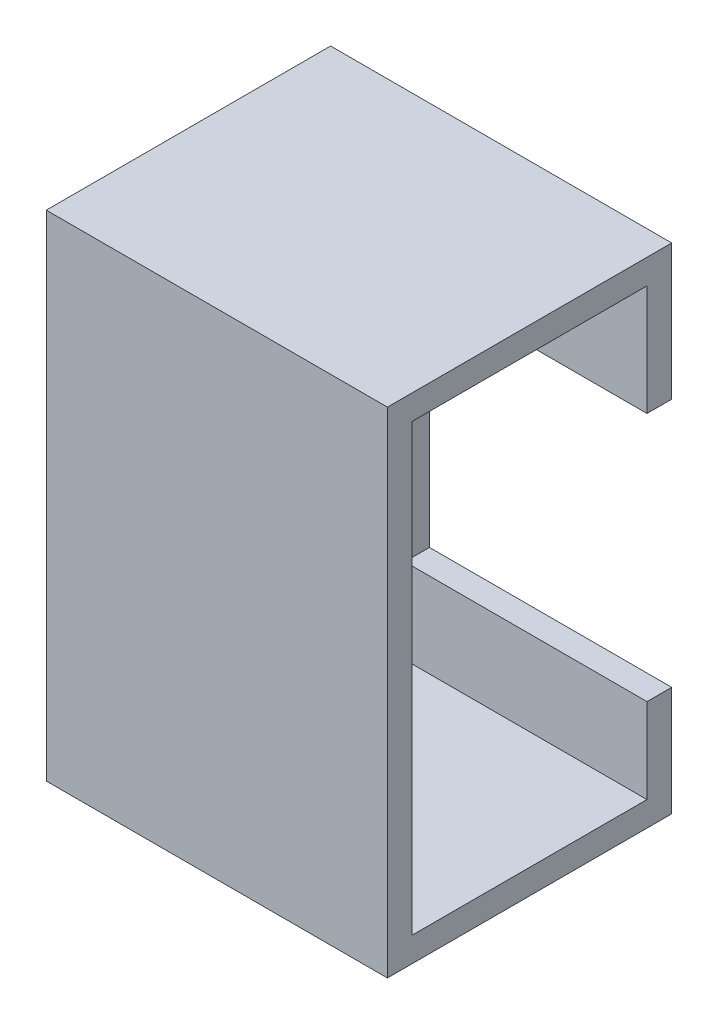
ISO-10303-21;
HEADER;
FILE_DESCRIPTION(('STEP AP214'),'2;1');
FILE_NAME('part.step','',(''),(''),'','','');
FILE_SCHEMA(('AUTOMOTIVE_DESIGN { 1 0 10303 214 1 1 1 1 }'));
ENDSEC;
DATA;
#1=APPLICATION_CONTEXT('core data for automotive mechanical design processes');
#2=APPLICATION_PROTOCOL_DEFINITION('international standard','automotive_design',2000,#1);
#3=PRODUCT_CONTEXT('',#1,'mechanical');
#4=PRODUCT('Part','Part','',(#3));
#5=PRODUCT_RELATED_PRODUCT_CATEGORY('part','',(#4));
#6=PRODUCT_DEFINITION_FORMATION('','',#4);
#7=PRODUCT_DEFINITION_CONTEXT('part definition',#1,'design');
#8=PRODUCT_DEFINITION('design','',#6,#7);
#9=PRODUCT_DEFINITION_SHAPE('','',#8);
#10=(LENGTH_UNIT() NAMED_UNIT(*) SI_UNIT(.MILLI.,.METRE.));
#11=(NAMED_UNIT(*) PLANE_ANGLE_UNIT() SI_UNIT($,.RADIAN.));
#12=(NAMED_UNIT(*) SI_UNIT($,.STERADIAN.) SOLID_ANGLE_UNIT());
#13=UNCERTAINTY_MEASURE_WITH_UNIT(LENGTH_MEASURE(1.E-05),#10,'distance_accuracy_value','');
#14=(GEOMETRIC_REPRESENTATION_CONTEXT(3) GLOBAL_UNCERTAINTY_ASSIGNED_CONTEXT((#13)) GLOBAL_UNIT_ASSIGNED_CONTEXT((#10,
#11,#12)) REPRESENTATION_CONTEXT('',''));
#15=CARTESIAN_POINT('',(0.,0.,0.));
#16=DIRECTION('',(0.,0.,1.));
#17=DIRECTION('',(1.,0.,0.));
#18=AXIS2_PLACEMENT_3D('',#15,#16,#17);
#19=CARTESIAN_POINT('',(-0.0250452000000723,82.477794755773,65.871101315515));
#20=DIRECTION('',(1.,0.,0.));
#21=DIRECTION('',(0.,0.,-1.));
#22=AXIS2_PLACEMENT_3D('',#19,#20,#21);
#23=PLANE('',#22);
#24=DIRECTION('',(0.,0.,1.));
#25=VECTOR('',#24,1.);
#26=CARTESIAN_POINT('',(-0.0250452000000723,87.4777847557731,63.996962315515));
#27=LINE('',#26,#25);
#28=CARTESIAN_POINT('',(-0.0250452000000723,87.4777847557731,62.9958213155149));
#29=VERTEX_POINT('',#28);
#30=CARTESIAN_POINT('',(-0.0250452000000723,87.4777847557731,68.746381315515));
#31=VERTEX_POINT('',#30);
#32=EDGE_CURVE('E11',#29,#31,#27,.T.);
#33=ORIENTED_EDGE('',*,*,#32,.F.);
#34=DIRECTION('',(0.,-1.,0.));
#35=VECTOR('',#34,1.);
#36=CARTESIAN_POINT('',(-0.0250452000000723,87.4777847557731,62.9958213155149));
#37=LINE('',#36,#35);
#38=CARTESIAN_POINT('',(-0.0250452000000745,77.4778047557729,62.9958213155149));
#39=VERTEX_POINT('',#38);
#40=EDGE_CURVE('E192',#29,#39,#37,.T.);
#41=ORIENTED_EDGE('',*,*,#40,.T.);
#42=DIRECTION('',(0.,0.,1.));
#43=VECTOR('',#42,1.);
#44=CARTESIAN_POINT('',(-0.0250452000000745,77.4778047557729,62.9958213155149));
#45=LINE('',#44,#43);
#46=CARTESIAN_POINT('',(-0.0250452000000723,77.4778047557729,68.746381315515));
#47=VERTEX_POINT('',#46);
#48=EDGE_CURVE('E185',#39,#47,#45,.T.);
#49=ORIENTED_EDGE('',*,*,#48,.T.);
#50=DIRECTION('',(0.,1.,0.));
#51=VECTOR('',#50,1.);
#52=CARTESIAN_POINT('',(-0.0250452000000723,77.4778047557729,68.746381315515));
#53=LINE('',#52,#51);
#54=EDGE_CURVE('E215',#47,#31,#53,.T.);
#55=ORIENTED_EDGE('',*,*,#54,.T.);
#56=EDGE_LOOP('',(#33,#41,#49,#55));
#57=FACE_BOUND('',#56,.T.);
#58=ADVANCED_FACE('F16',(#57),#23,.F.);
#59=CARTESIAN_POINT('',(0.874954799999929,82.477794755773,65.871101315515));
#60=DIRECTION('',(1.,0.,0.));
#61=DIRECTION('',(0.,0.,-1.));
#62=AXIS2_PLACEMENT_3D('',#59,#60,#61);
#63=PLANE('',#62);
#64=DIRECTION('',(0.,0.,1.));
#65=VECTOR('',#64,1.);
#66=CARTESIAN_POINT('',(0.874954799999929,86.977404755773,63.4962013155149));
#67=LINE('',#66,#65);
#68=CARTESIAN_POINT('',(0.874954799999929,86.977404755773,63.4962013155149));
#69=VERTEX_POINT('',#68);
#70=CARTESIAN_POINT('',(0.874954799999929,86.977404755773,68.246001315515));
#71=VERTEX_POINT('',#70);
#72=EDGE_CURVE('E163',#69,#71,#67,.T.);
#73=ORIENTED_EDGE('',*,*,#72,.T.);
#74=DIRECTION('',(0.,-1.,0.));
#75=VECTOR('',#74,1.);
#76=CARTESIAN_POINT('',(0.874954799999929,86.977404755773,68.246001315515));
#77=LINE('',#76,#75);
#78=CARTESIAN_POINT('',(0.874954799999929,77.978184755773,68.246001315515));
#79=VERTEX_POINT('',#78);
#80=EDGE_CURVE('E174',#71,#79,#77,.T.);
#81=ORIENTED_EDGE('',*,*,#80,.T.);
#82=DIRECTION('',(0.,0.,-1.));
#83=VECTOR('',#82,1.);
#84=CARTESIAN_POINT('',(0.874954799999929,77.978184755773,68.246001315515));
#85=LINE('',#84,#83);
#86=CARTESIAN_POINT('',(0.874954799999926,77.978184755773,63.4962013155149));
#87=VERTEX_POINT('',#86);
#88=EDGE_CURVE('E158',#79,#87,#85,.T.);
#89=ORIENTED_EDGE('',*,*,#88,.T.);
#90=DIRECTION('',(0.,1.,0.));
#91=VECTOR('',#90,1.);
#92=CARTESIAN_POINT('',(0.874954799999926,77.978184755773,63.4962013155149));
#93=LINE('',#92,#91);
#94=EDGE_CURVE('E189',#87,#69,#93,.T.);
#95=ORIENTED_EDGE('',*,*,#94,.T.);
#96=EDGE_LOOP('',(#73,#81,#89,#95));
#97=FACE_BOUND('',#96,.T.);
#98=ADVANCED_FACE('F305',(#97),#63,.T.);
#99=CARTESIAN_POINT('',(-0.0250452000000723,87.4777847557731,62.9958213155149));
#100=DIRECTION('',(0.,1.,0.));
#101=DIRECTION('',(1.,0.,0.));
#102=AXIS2_PLACEMENT_3D('',#99,#100,#101);
#103=PLANE('',#102);
#104=ORIENTED_EDGE('',*,*,#32,.T.);
#105=DIRECTION('',(1.,0.,0.));
#106=VECTOR('',#105,1.);
#107=CARTESIAN_POINT('',(-0.0250452000000723,87.4777847557731,68.746381315515));
#108=LINE('',#107,#106);
#109=CARTESIAN_POINT('',(6.87495479999993,87.4777847557731,68.746381315515));
#110=VERTEX_POINT('',#109);
#111=EDGE_CURVE('E27',#31,#110,#108,.T.);
#112=ORIENTED_EDGE('',*,*,#111,.T.);
#113=DIRECTION('',(0.,0.,1.));
#114=VECTOR('',#113,1.);
#115=CARTESIAN_POINT('',(6.87495479999993,87.4777847557731,63.996962315515));
#116=LINE('',#115,#114);
#117=CARTESIAN_POINT('',(6.87495479999993,87.4777847557731,62.9958213155149));
#118=VERTEX_POINT('',#117);
#119=EDGE_CURVE('E208',#118,#110,#116,.T.);
#120=ORIENTED_EDGE('',*,*,#119,.F.);
#121=DIRECTION('',(1.,0.,0.));
#122=VECTOR('',#121,1.);
#123=CARTESIAN_POINT('',(-0.0250452000000723,87.4777847557731,62.9958213155149));
#124=LINE('',#123,#122);
#125=EDGE_CURVE('E190',#29,#118,#124,.T.);
#126=ORIENTED_EDGE('',*,*,#125,.F.);
#127=EDGE_LOOP('',(#104,#112,#120,#126));
#128=FACE_BOUND('',#127,.T.);
#129=ADVANCED_FACE('F18',(#128),#103,.T.);
#130=CARTESIAN_POINT('',(-0.0250452000000723,87.4777847557731,68.746381315515));
#131=DIRECTION('',(0.,0.,1.));
#132=DIRECTION('',(1.,0.,0.));
#133=AXIS2_PLACEMENT_3D('',#130,#131,#132);
#134=PLANE('',#133);
#135=ORIENTED_EDGE('',*,*,#54,.F.);
#136=DIRECTION('',(1.,0.,0.));
#137=VECTOR('',#136,1.);
#138=CARTESIAN_POINT('',(-0.0250452000000723,77.4778047557729,68.746381315515));
#139=LINE('',#138,#137);
#140=CARTESIAN_POINT('',(6.87495479999993,77.4778047557729,68.746381315515));
#141=VERTEX_POINT('',#140);
#142=EDGE_CURVE('E109',#47,#141,#139,.T.);
#143=ORIENTED_EDGE('',*,*,#142,.T.);
#144=DIRECTION('',(0.,-1.,0.));
#145=VECTOR('',#144,1.);
#146=CARTESIAN_POINT('',(6.87495479999993,77.4778047557729,68.746381315515));
#147=LINE('',#146,#145);
#148=EDGE_CURVE('E211',#110,#141,#147,.T.);
#149=ORIENTED_EDGE('',*,*,#148,.F.);
#150=ORIENTED_EDGE('',*,*,#111,.F.);
#151=EDGE_LOOP('',(#135,#143,#149,#150));
#152=FACE_BOUND('',#151,.T.);
#153=ADVANCED_FACE('F295',(#152),#134,.T.);
#154=CARTESIAN_POINT('',(-0.02504520000007,77.4778047557729,68.746381315515));
#155=DIRECTION('',(0.,-1.,0.));
#156=DIRECTION('',(-1.,0.,0.));
#157=AXIS2_PLACEMENT_3D('',#154,#155,#156);
#158=PLANE('',#157);
#159=ORIENTED_EDGE('',*,*,#48,.F.);
#160=DIRECTION('',(1.,0.,0.));
#161=VECTOR('',#160,1.);
#162=CARTESIAN_POINT('',(-0.0250452000000745,77.4778047557729,62.9958213155149));
#163=LINE('',#162,#161);
#164=CARTESIAN_POINT('',(6.87495479999993,77.4778047557729,62.9958213155149));
#165=VERTEX_POINT('',#164);
#166=EDGE_CURVE('E94',#39,#165,#163,.T.);
#167=ORIENTED_EDGE('',*,*,#166,.T.);
#168=DIRECTION('',(0.,0.,-1.));
#169=VECTOR('',#168,1.);
#170=CARTESIAN_POINT('',(6.87495479999993,77.4778047557729,62.9958213155149));
#171=LINE('',#170,#169);
#172=EDGE_CURVE('E232',#141,#165,#171,.T.);
#173=ORIENTED_EDGE('',*,*,#172,.F.);
#174=ORIENTED_EDGE('',*,*,#142,.F.);
#175=EDGE_LOOP('',(#159,#167,#173,#174));
#176=FACE_BOUND('',#175,.T.);
#177=ADVANCED_FACE('F297',(#176),#158,.T.);
#178=CARTESIAN_POINT('',(-0.0250452000000723,86.977404755773,63.4962013155149));
#179=DIRECTION('',(0.,0.,1.));
#180=DIRECTION('',(1.,0.,0.));
#181=AXIS2_PLACEMENT_3D('',#178,#179,#180);
#182=PLANE('',#181);
#183=ORIENTED_EDGE('',*,*,#94,.F.);
#184=DIRECTION('',(1.,0.,0.));
#185=VECTOR('',#184,1.);
#186=CARTESIAN_POINT('',(-0.0250452000000745,77.978184755773,63.4962013155149));
#187=LINE('',#186,#185);
#188=CARTESIAN_POINT('',(6.87495479999993,77.978184755773,63.4962013155149));
#189=VERTEX_POINT('',#188);
#190=EDGE_CURVE('E194',#87,#189,#187,.T.);
#191=ORIENTED_EDGE('',*,*,#190,.T.);
#192=DIRECTION('',(0.,-1.,0.));
#193=VECTOR('',#192,1.);
#194=CARTESIAN_POINT('',(6.87495479999993,77.978184755773,63.4962013155149));
#195=LINE('',#194,#193);
#196=CARTESIAN_POINT('',(6.87495479999993,79.6940253678448,63.4962013155149));
#197=VERTEX_POINT('',#196);
#198=EDGE_CURVE('E148',#197,#189,#195,.T.);
#199=ORIENTED_EDGE('',*,*,#198,.F.);
#200=DIRECTION('',(-1.,0.,0.));
#201=VECTOR('',#200,1.);
#202=CARTESIAN_POINT('',(3.42495479999993,79.6940253678448,63.4962013155149));
#203=LINE('',#202,#201);
#204=CARTESIAN_POINT('',(1.97495479999993,79.6940253678448,63.4962013155149));
#205=VERTEX_POINT('',#204);
#206=EDGE_CURVE('E200',#197,#205,#203,.T.);
#207=ORIENTED_EDGE('',*,*,#206,.T.);
#208=DIRECTION('',(0.,1.,0.));
#209=VECTOR('',#208,1.);
#210=CARTESIAN_POINT('',(1.97495479999993,84.5974293725334,63.4962013155149));
#211=LINE('',#210,#209);
#212=CARTESIAN_POINT('',(1.97495479999993,84.7408826107429,63.4962013155149));
#213=VERTEX_POINT('',#212);
#214=EDGE_CURVE('E245',#205,#213,#211,.T.);
#215=ORIENTED_EDGE('',*,*,#214,.T.);
#216=DIRECTION('',(1.,0.,0.));
#217=VECTOR('',#216,1.);
#218=CARTESIAN_POINT('',(3.42495479999993,84.7408826107429,63.4962013155149));
#219=LINE('',#218,#217);
#220=CARTESIAN_POINT('',(6.87495479999993,84.7408826107429,63.4962013155149));
#221=VERTEX_POINT('',#220);
#222=EDGE_CURVE('E220',#213,#221,#219,.T.);
#223=ORIENTED_EDGE('',*,*,#222,.T.);
#224=DIRECTION('',(0.,-1.,0.));
#225=VECTOR('',#224,1.);
#226=CARTESIAN_POINT('',(6.87495479999993,77.978184755773,63.4962013155149));
#227=LINE('',#226,#225);
#228=CARTESIAN_POINT('',(6.87495479999993,86.9774047557729,63.4962013155149));
#229=VERTEX_POINT('',#228);
#230=EDGE_CURVE('E152',#229,#221,#227,.T.);
#231=ORIENTED_EDGE('',*,*,#230,.F.);
#232=DIRECTION('',(1.,0.,0.));
#233=VECTOR('',#232,1.);
#234=CARTESIAN_POINT('',(-0.0250452000000723,86.977404755773,63.4962013155149));
#235=LINE('',#234,#233);
#236=EDGE_CURVE('E226',#69,#229,#235,.T.);
#237=ORIENTED_EDGE('',*,*,#236,.F.);
#238=EDGE_LOOP('',(#183,#191,#199,#207,#215,#223,#231,#237));
#239=FACE_BOUND('',#238,.T.);
#240=ADVANCED_FACE('F284',(#239),#182,.T.);
#241=CARTESIAN_POINT('',(-0.0250452000000745,77.978184755773,63.4962013155149));
#242=DIRECTION('',(0.,1.,0.));
#243=DIRECTION('',(1.,0.,0.));
#244=AXIS2_PLACEMENT_3D('',#241,#242,#243);
#245=PLANE('',#244);
#246=ORIENTED_EDGE('',*,*,#88,.F.);
#247=DIRECTION('',(1.,0.,0.));
#248=VECTOR('',#247,1.);
#249=CARTESIAN_POINT('',(-0.0250452000000723,77.978184755773,68.246001315515));
#250=LINE('',#249,#248);
#251=CARTESIAN_POINT('',(6.87495479999993,77.978184755773,68.246001315515));
#252=VERTEX_POINT('',#251);
#253=EDGE_CURVE('E155',#79,#252,#250,.T.);
#254=ORIENTED_EDGE('',*,*,#253,.T.);
#255=DIRECTION('',(0.,0.,1.));
#256=VECTOR('',#255,1.);
#257=CARTESIAN_POINT('',(6.87495479999993,77.978184755773,68.246001315515));
#258=LINE('',#257,#256);
#259=EDGE_CURVE('E139',#189,#252,#258,.T.);
#260=ORIENTED_EDGE('',*,*,#259,.F.);
#261=ORIENTED_EDGE('',*,*,#190,.F.);
#262=EDGE_LOOP('',(#246,#254,#260,#261));
#263=FACE_BOUND('',#262,.T.);
#264=ADVANCED_FACE('F156',(#263),#245,.T.);
#265=CARTESIAN_POINT('',(-0.0250452000000745,77.4778047557729,62.9958213155149));
#266=DIRECTION('',(0.,0.,-1.));
#267=DIRECTION('',(-1.,0.,0.));
#268=AXIS2_PLACEMENT_3D('',#265,#266,#267);
#269=PLANE('',#268);
#270=DIRECTION('',(-1.,0.,0.));
#271=VECTOR('',#270,1.);
#272=CARTESIAN_POINT('',(3.42495479999993,84.7408826107429,62.9958213155149));
#273=LINE('',#272,#271);
#274=CARTESIAN_POINT('',(6.87495479999993,84.7408826107429,62.9958213155149));
#275=VERTEX_POINT('',#274);
#276=CARTESIAN_POINT('',(1.97495479999993,84.7408826107429,62.9958213155149));
#277=VERTEX_POINT('',#276);
#278=EDGE_CURVE('E199',#275,#277,#273,.T.);
#279=ORIENTED_EDGE('',*,*,#278,.T.);
#280=DIRECTION('',(0.,-1.,0.));
#281=VECTOR('',#280,1.);
#282=CARTESIAN_POINT('',(1.97495479999993,79.8476293725333,62.9958213155149));
#283=LINE('',#282,#281);
#284=CARTESIAN_POINT('',(1.97495479999993,79.6940253678448,62.9958213155149));
#285=VERTEX_POINT('',#284);
#286=EDGE_CURVE('E204',#277,#285,#283,.T.);
#287=ORIENTED_EDGE('',*,*,#286,.T.);
#288=DIRECTION('',(1.,0.,0.));
#289=VECTOR('',#288,1.);
#290=CARTESIAN_POINT('',(3.42495479999993,79.6940253678448,62.9958213155149));
#291=LINE('',#290,#289);
#292=CARTESIAN_POINT('',(6.87495479999993,79.6940253678448,62.9958213155149));
#293=VERTEX_POINT('',#292);
#294=EDGE_CURVE('E179',#285,#293,#291,.T.);
#295=ORIENTED_EDGE('',*,*,#294,.T.);
#296=DIRECTION('',(0.,1.,0.));
#297=VECTOR('',#296,1.);
#298=CARTESIAN_POINT('',(6.87495479999993,87.4777847557731,62.9958213155149));
#299=LINE('',#298,#297);
#300=EDGE_CURVE('E207',#165,#293,#299,.T.);
#301=ORIENTED_EDGE('',*,*,#300,.F.);
#302=ORIENTED_EDGE('',*,*,#166,.F.);
#303=ORIENTED_EDGE('',*,*,#40,.F.);
#304=ORIENTED_EDGE('',*,*,#125,.T.);
#305=DIRECTION('',(0.,1.,0.));
#306=VECTOR('',#305,1.);
#307=CARTESIAN_POINT('',(6.87495479999993,87.4777847557731,62.9958213155149));
#308=LINE('',#307,#306);
#309=EDGE_CURVE('E212',#275,#118,#308,.T.);
#310=ORIENTED_EDGE('',*,*,#309,.F.);
#311=EDGE_LOOP('',(#279,#287,#295,#301,#302,#303,#304,#310));
#312=FACE_BOUND('',#311,.T.);
#313=ADVANCED_FACE('F291',(#312),#269,.T.);
#314=CARTESIAN_POINT('',(6.87495479999993,82.477794755773,65.871101315515));
#315=DIRECTION('',(1.,0.,0.));
#316=DIRECTION('',(0.,0.,-1.));
#317=AXIS2_PLACEMENT_3D('',#314,#315,#316);
#318=PLANE('',#317);
#319=DIRECTION('',(0.,0.,-1.));
#320=VECTOR('',#319,1.);
#321=CARTESIAN_POINT('',(6.87495479999993,84.7408826107429,64.6836513155149));
#322=LINE('',#321,#320);
#323=EDGE_CURVE('E225',#221,#275,#322,.T.);
#324=ORIENTED_EDGE('',*,*,#323,.T.);
#325=ORIENTED_EDGE('',*,*,#309,.T.);
#326=ORIENTED_EDGE('',*,*,#119,.T.);
#327=ORIENTED_EDGE('',*,*,#148,.T.);
#328=ORIENTED_EDGE('',*,*,#172,.T.);
#329=ORIENTED_EDGE('',*,*,#300,.T.);
#330=DIRECTION('',(0.,0.,1.));
#331=VECTOR('',#330,1.);
#332=CARTESIAN_POINT('',(6.87495479999993,79.6940253678448,64.4334613155149));
#333=LINE('',#332,#331);
#334=EDGE_CURVE('E184',#293,#197,#333,.T.);
#335=ORIENTED_EDGE('',*,*,#334,.T.);
#336=ORIENTED_EDGE('',*,*,#198,.T.);
#337=ORIENTED_EDGE('',*,*,#259,.T.);
#338=DIRECTION('',(0.,1.,0.));
#339=VECTOR('',#338,1.);
#340=CARTESIAN_POINT('',(6.87495479999993,86.9774047557729,68.246001315515));
#341=LINE('',#340,#339);
#342=CARTESIAN_POINT('',(6.87495479999993,86.9774047557729,68.246001315515));
#343=VERTEX_POINT('',#342);
#344=EDGE_CURVE('E145',#252,#343,#341,.T.);
#345=ORIENTED_EDGE('',*,*,#344,.T.);
#346=DIRECTION('',(0.,0.,-1.));
#347=VECTOR('',#346,1.);
#348=CARTESIAN_POINT('',(6.87495479999993,86.9774047557729,63.4962013155149));
#349=LINE('',#348,#347);
#350=EDGE_CURVE('E20',#343,#229,#349,.T.);
#351=ORIENTED_EDGE('',*,*,#350,.T.);
#352=ORIENTED_EDGE('',*,*,#230,.T.);
#353=EDGE_LOOP('',(#324,#325,#326,#327,#328,#329,#335,#336,#337,#345,#351,#352));
#354=FACE_BOUND('',#353,.T.);
#355=ADVANCED_FACE('F142',(#354),#318,.T.);
#356=CARTESIAN_POINT('',(1.97495479999993,82.2174539892939,63.2460113155149));
#357=DIRECTION('',(-1.,0.,0.));
#358=DIRECTION('',(0.,1.,0.));
#359=AXIS2_PLACEMENT_3D('',#356,#357,#358);
#360=PLANE('',#359);
#361=ORIENTED_EDGE('',*,*,#286,.F.);
#362=DIRECTION('',(0.,0.,-1.));
#363=VECTOR('',#362,1.);
#364=CARTESIAN_POINT('',(1.97495479999993,84.7408826107429,62.9958213155149));
#365=LINE('',#364,#363);
#366=EDGE_CURVE('E224',#213,#277,#365,.T.);
#367=ORIENTED_EDGE('',*,*,#366,.F.);
#368=ORIENTED_EDGE('',*,*,#214,.F.);
#369=DIRECTION('',(0.,0.,1.));
#370=VECTOR('',#369,1.);
#371=CARTESIAN_POINT('',(1.97495479999993,79.6940253678448,63.4962013155149));
#372=LINE('',#371,#370);
#373=EDGE_CURVE('E183',#285,#205,#372,.T.);
#374=ORIENTED_EDGE('',*,*,#373,.F.);
#375=EDGE_LOOP('',(#361,#367,#368,#374));
#376=FACE_BOUND('',#375,.T.);
#377=ADVANCED_FACE('F322',(#376),#360,.F.);
#378=CARTESIAN_POINT('',(6.87495479999993,79.6940253678448,62.9958213155149));
#379=DIRECTION('',(0.,-1.,0.));
#380=DIRECTION('',(-1.,0.,0.));
#381=AXIS2_PLACEMENT_3D('',#378,#379,#380);
#382=PLANE('',#381);
#383=ORIENTED_EDGE('',*,*,#334,.F.);
#384=ORIENTED_EDGE('',*,*,#294,.F.);
#385=ORIENTED_EDGE('',*,*,#373,.T.);
#386=ORIENTED_EDGE('',*,*,#206,.F.);
#387=EDGE_LOOP('',(#383,#384,#385,#386));
#388=FACE_BOUND('',#387,.T.);
#389=ADVANCED_FACE('F319',(#388),#382,.F.);
#390=CARTESIAN_POINT('',(6.87495479999993,84.7408826107429,63.4962013155149));
#391=DIRECTION('',(0.,1.,0.));
#392=DIRECTION('',(1.,0.,0.));
#393=AXIS2_PLACEMENT_3D('',#390,#391,#392);
#394=PLANE('',#393);
#395=ORIENTED_EDGE('',*,*,#323,.F.);
#396=ORIENTED_EDGE('',*,*,#222,.F.);
#397=ORIENTED_EDGE('',*,*,#366,.T.);
#398=ORIENTED_EDGE('',*,*,#278,.F.);
#399=EDGE_LOOP('',(#395,#396,#397,#398));
#400=FACE_BOUND('',#399,.T.);
#401=ADVANCED_FACE('F289',(#400),#394,.F.);
#402=CARTESIAN_POINT('',(-0.0250452000000723,86.977404755773,68.246001315515));
#403=DIRECTION('',(0.,-1.,0.));
#404=DIRECTION('',(-1.,0.,0.));
#405=AXIS2_PLACEMENT_3D('',#402,#403,#404);
#406=PLANE('',#405);
#407=ORIENTED_EDGE('',*,*,#72,.F.);
#408=ORIENTED_EDGE('',*,*,#236,.T.);
#409=ORIENTED_EDGE('',*,*,#350,.F.);
#410=DIRECTION('',(1.,0.,0.));
#411=VECTOR('',#410,1.);
#412=CARTESIAN_POINT('',(-0.0250452000000723,86.977404755773,68.246001315515));
#413=LINE('',#412,#411);
#414=EDGE_CURVE('E167',#71,#343,#413,.T.);
#415=ORIENTED_EDGE('',*,*,#414,.F.);
#416=EDGE_LOOP('',(#407,#408,#409,#415));
#417=FACE_BOUND('',#416,.T.);
#418=ADVANCED_FACE('F281',(#417),#406,.T.);
#419=CARTESIAN_POINT('',(-0.0250452000000723,77.978184755773,68.246001315515));
#420=DIRECTION('',(0.,0.,-1.));
#421=DIRECTION('',(-1.,0.,0.));
#422=AXIS2_PLACEMENT_3D('',#419,#420,#421);
#423=PLANE('',#422);
#424=ORIENTED_EDGE('',*,*,#80,.F.);
#425=ORIENTED_EDGE('',*,*,#414,.T.);
#426=ORIENTED_EDGE('',*,*,#344,.F.);
#427=ORIENTED_EDGE('',*,*,#253,.F.);
#428=EDGE_LOOP('',(#424,#425,#426,#427));
#429=FACE_BOUND('',#428,.T.);
#430=ADVANCED_FACE('F165',(#429),#423,.T.);
#431=CLOSED_SHELL('',(#58,#98,#129,#153,#177,#240,#264,#313,#355,#377,#389,#401,#418,#430));
#432=MANIFOLD_SOLID_BREP('B1',#431);
#433=ADVANCED_BREP_SHAPE_REPRESENTATION('',(#18,#432),#14);
#434=SHAPE_DEFINITION_REPRESENTATION(#9,#433);
ENDSEC;
END-ISO-10303-21;
